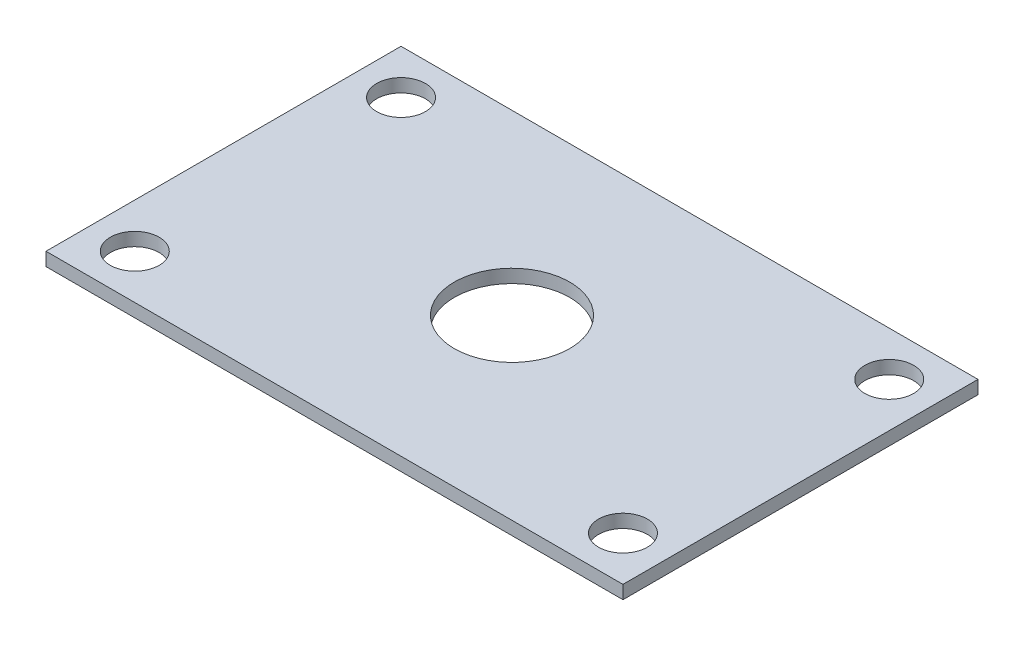
ISO-10303-21;
HEADER;
FILE_DESCRIPTION(('STEP AP214'),'2;1');
FILE_NAME('part.step','',(''),(''),'','','');
FILE_SCHEMA(('AUTOMOTIVE_DESIGN { 1 0 10303 214 1 1 1 1 }'));
ENDSEC;
DATA;
#1=APPLICATION_CONTEXT('core data for automotive mechanical design processes');
#2=APPLICATION_PROTOCOL_DEFINITION('international standard','automotive_design',2000,#1);
#3=PRODUCT_CONTEXT('',#1,'mechanical');
#4=PRODUCT('Part','Part','',(#3));
#5=PRODUCT_RELATED_PRODUCT_CATEGORY('part','',(#4));
#6=PRODUCT_DEFINITION_FORMATION('','',#4);
#7=PRODUCT_DEFINITION_CONTEXT('part definition',#1,'design');
#8=PRODUCT_DEFINITION('design','',#6,#7);
#9=PRODUCT_DEFINITION_SHAPE('','',#8);
#10=(LENGTH_UNIT() NAMED_UNIT(*) SI_UNIT(.MILLI.,.METRE.));
#11=(NAMED_UNIT(*) PLANE_ANGLE_UNIT() SI_UNIT($,.RADIAN.));
#12=(NAMED_UNIT(*) SI_UNIT($,.STERADIAN.) SOLID_ANGLE_UNIT());
#13=UNCERTAINTY_MEASURE_WITH_UNIT(LENGTH_MEASURE(1.E-05),#10,'distance_accuracy_value','');
#14=(GEOMETRIC_REPRESENTATION_CONTEXT(3) GLOBAL_UNCERTAINTY_ASSIGNED_CONTEXT((#13)) GLOBAL_UNIT_ASSIGNED_CONTEXT((#10,
#11,#12)) REPRESENTATION_CONTEXT('',''));
#15=CARTESIAN_POINT('',(0.,0.,0.));
#16=DIRECTION('',(0.,0.,1.));
#17=DIRECTION('',(1.,0.,0.));
#18=AXIS2_PLACEMENT_3D('',#15,#16,#17);
#19=CARTESIAN_POINT('',(65.,3.,-40.));
#20=DIRECTION('',(-1.,0.,0.));
#21=DIRECTION('',(0.,0.,1.));
#22=AXIS2_PLACEMENT_3D('',#19,#20,#21);
#23=PLANE('',#22);
#24=DIRECTION('',(0.,0.,-1.));
#25=VECTOR('',#24,1.);
#26=CARTESIAN_POINT('',(65.,0.,-40.));
#27=LINE('',#26,#25);
#28=CARTESIAN_POINT('',(65.,0.,40.));
#29=VERTEX_POINT('',#28);
#30=CARTESIAN_POINT('',(65.,0.,-40.));
#31=VERTEX_POINT('',#30);
#32=EDGE_CURVE('E98',#29,#31,#27,.T.);
#33=ORIENTED_EDGE('',*,*,#32,.T.);
#34=DIRECTION('',(0.,-1.,0.));
#35=VECTOR('',#34,1.);
#36=CARTESIAN_POINT('',(65.,3.,-40.));
#37=LINE('',#36,#35);
#38=CARTESIAN_POINT('',(65.,3.,-40.));
#39=VERTEX_POINT('',#38);
#40=EDGE_CURVE('E11',#39,#31,#37,.T.);
#41=ORIENTED_EDGE('',*,*,#40,.F.);
#42=DIRECTION('',(0.,0.,-1.));
#43=VECTOR('',#42,1.);
#44=CARTESIAN_POINT('',(65.,3.,-40.));
#45=LINE('',#44,#43);
#46=CARTESIAN_POINT('',(65.,3.,40.));
#47=VERTEX_POINT('',#46);
#48=EDGE_CURVE('E86',#47,#39,#45,.T.);
#49=ORIENTED_EDGE('',*,*,#48,.F.);
#50=DIRECTION('',(0.,-1.,0.));
#51=VECTOR('',#50,1.);
#52=CARTESIAN_POINT('',(65.,3.,40.));
#53=LINE('',#52,#51);
#54=EDGE_CURVE('E94',#47,#29,#53,.T.);
#55=ORIENTED_EDGE('',*,*,#54,.T.);
#56=EDGE_LOOP('',(#33,#41,#49,#55));
#57=FACE_BOUND('',#56,.T.);
#58=ADVANCED_FACE('F35',(#57),#23,.F.);
#59=CARTESIAN_POINT('',(-65.,3.,-40.));
#60=DIRECTION('',(0.,0.,1.));
#61=DIRECTION('',(1.,0.,0.));
#62=AXIS2_PLACEMENT_3D('',#59,#60,#61);
#63=PLANE('',#62);
#64=DIRECTION('',(-1.,0.,0.));
#65=VECTOR('',#64,1.);
#66=CARTESIAN_POINT('',(-65.,0.,-40.));
#67=LINE('',#66,#65);
#68=CARTESIAN_POINT('',(-65.,0.,-40.));
#69=VERTEX_POINT('',#68);
#70=EDGE_CURVE('E90',#31,#69,#67,.T.);
#71=ORIENTED_EDGE('',*,*,#70,.T.);
#72=DIRECTION('',(0.,-1.,0.));
#73=VECTOR('',#72,1.);
#74=CARTESIAN_POINT('',(-65.,3.,-40.));
#75=LINE('',#74,#73);
#76=CARTESIAN_POINT('',(-65.,3.,-40.));
#77=VERTEX_POINT('',#76);
#78=EDGE_CURVE('E43',#77,#69,#75,.T.);
#79=ORIENTED_EDGE('',*,*,#78,.F.);
#80=DIRECTION('',(-1.,0.,0.));
#81=VECTOR('',#80,1.);
#82=CARTESIAN_POINT('',(-65.,3.,-40.));
#83=LINE('',#82,#81);
#84=EDGE_CURVE('E81',#39,#77,#83,.T.);
#85=ORIENTED_EDGE('',*,*,#84,.F.);
#86=ORIENTED_EDGE('',*,*,#40,.T.);
#87=EDGE_LOOP('',(#71,#79,#85,#86));
#88=FACE_BOUND('',#87,.T.);
#89=ADVANCED_FACE('F89',(#88),#63,.F.);
#90=CARTESIAN_POINT('',(-65.,3.,-40.));
#91=DIRECTION('',(1.,0.,0.));
#92=DIRECTION('',(0.,0.,-1.));
#93=AXIS2_PLACEMENT_3D('',#90,#91,#92);
#94=PLANE('',#93);
#95=DIRECTION('',(0.,0.,1.));
#96=VECTOR('',#95,1.);
#97=CARTESIAN_POINT('',(-65.,0.,-40.));
#98=LINE('',#97,#96);
#99=CARTESIAN_POINT('',(-65.,0.,40.));
#100=VERTEX_POINT('',#99);
#101=EDGE_CURVE('E68',#69,#100,#98,.T.);
#102=ORIENTED_EDGE('',*,*,#101,.T.);
#103=DIRECTION('',(0.,-1.,0.));
#104=VECTOR('',#103,1.);
#105=CARTESIAN_POINT('',(-65.,3.,40.));
#106=LINE('',#105,#104);
#107=CARTESIAN_POINT('',(-65.,3.,40.));
#108=VERTEX_POINT('',#107);
#109=EDGE_CURVE('E91',#108,#100,#106,.T.);
#110=ORIENTED_EDGE('',*,*,#109,.F.);
#111=DIRECTION('',(0.,0.,1.));
#112=VECTOR('',#111,1.);
#113=CARTESIAN_POINT('',(-65.,3.,-40.));
#114=LINE('',#113,#112);
#115=EDGE_CURVE('E84',#77,#108,#114,.T.);
#116=ORIENTED_EDGE('',*,*,#115,.F.);
#117=ORIENTED_EDGE('',*,*,#78,.T.);
#118=EDGE_LOOP('',(#102,#110,#116,#117));
#119=FACE_BOUND('',#118,.T.);
#120=ADVANCED_FACE('F92',(#119),#94,.F.);
#121=CARTESIAN_POINT('',(-65.,3.,40.));
#122=DIRECTION('',(0.,0.,-1.));
#123=DIRECTION('',(-1.,0.,0.));
#124=AXIS2_PLACEMENT_3D('',#121,#122,#123);
#125=PLANE('',#124);
#126=DIRECTION('',(1.,0.,0.));
#127=VECTOR('',#126,1.);
#128=CARTESIAN_POINT('',(-65.,0.,40.));
#129=LINE('',#128,#127);
#130=EDGE_CURVE('E74',#100,#29,#129,.T.);
#131=ORIENTED_EDGE('',*,*,#130,.T.);
#132=ORIENTED_EDGE('',*,*,#54,.F.);
#133=DIRECTION('',(1.,0.,0.));
#134=VECTOR('',#133,1.);
#135=CARTESIAN_POINT('',(-65.,3.,40.));
#136=LINE('',#135,#134);
#137=EDGE_CURVE('E51',#108,#47,#136,.T.);
#138=ORIENTED_EDGE('',*,*,#137,.F.);
#139=ORIENTED_EDGE('',*,*,#109,.T.);
#140=EDGE_LOOP('',(#131,#132,#138,#139));
#141=FACE_BOUND('',#140,.T.);
#142=ADVANCED_FACE('F106',(#141),#125,.F.);
#143=CARTESIAN_POINT('',(0.,3.,0.));
#144=DIRECTION('',(0.,1.,0.));
#145=DIRECTION('',(0.,0.,1.));
#146=AXIS2_PLACEMENT_3D('',#143,#144,#145);
#147=PLANE('',#146);
#148=CARTESIAN_POINT('',(55.,3.,30.));
#149=DIRECTION('',(0.,1.,0.));
#150=DIRECTION('',(0.,0.,1.));
#151=AXIS2_PLACEMENT_3D('',#148,#149,#150);
#152=CIRCLE('',#151,5.5);
#153=CARTESIAN_POINT('',(55.,3.,35.5));
#154=VERTEX_POINT('',#153);
#155=EDGE_CURVE('E136',#154,#154,#152,.T.);
#156=ORIENTED_EDGE('',*,*,#155,.F.);
#157=EDGE_LOOP('',(#156));
#158=FACE_BOUND('',#157,.T.);
#159=CARTESIAN_POINT('',(55.,3.,-30.));
#160=DIRECTION('',(0.,1.,0.));
#161=DIRECTION('',(0.,0.,1.));
#162=AXIS2_PLACEMENT_3D('',#159,#160,#161);
#163=CIRCLE('',#162,5.5);
#164=CARTESIAN_POINT('',(55.,3.,-24.5));
#165=VERTEX_POINT('',#164);
#166=EDGE_CURVE('E130',#165,#165,#163,.T.);
#167=ORIENTED_EDGE('',*,*,#166,.F.);
#168=EDGE_LOOP('',(#167));
#169=FACE_BOUND('',#168,.T.);
#170=CARTESIAN_POINT('',(-55.,3.,30.));
#171=DIRECTION('',(0.,1.,0.));
#172=DIRECTION('',(0.,0.,1.));
#173=AXIS2_PLACEMENT_3D('',#170,#171,#172);
#174=CIRCLE('',#173,5.5);
#175=CARTESIAN_POINT('',(-55.,3.,35.5));
#176=VERTEX_POINT('',#175);
#177=EDGE_CURVE('E124',#176,#176,#174,.T.);
#178=ORIENTED_EDGE('',*,*,#177,.F.);
#179=EDGE_LOOP('',(#178));
#180=FACE_BOUND('',#179,.T.);
#181=CARTESIAN_POINT('',(-55.,3.,-30.));
#182=DIRECTION('',(0.,1.,0.));
#183=DIRECTION('',(0.,0.,1.));
#184=AXIS2_PLACEMENT_3D('',#181,#182,#183);
#185=CIRCLE('',#184,5.5);
#186=CARTESIAN_POINT('',(-55.,3.,-24.5));
#187=VERTEX_POINT('',#186);
#188=EDGE_CURVE('E118',#187,#187,#185,.T.);
#189=ORIENTED_EDGE('',*,*,#188,.F.);
#190=EDGE_LOOP('',(#189));
#191=FACE_BOUND('',#190,.T.);
#192=CARTESIAN_POINT('',(0.,3.,0.));
#193=DIRECTION('',(0.,1.,0.));
#194=DIRECTION('',(0.,0.,1.));
#195=AXIS2_PLACEMENT_3D('',#192,#193,#194);
#196=CIRCLE('',#195,13.);
#197=CARTESIAN_POINT('',(0.,3.,13.));
#198=VERTEX_POINT('',#197);
#199=EDGE_CURVE('E112',#198,#198,#196,.T.);
#200=ORIENTED_EDGE('',*,*,#199,.F.);
#201=EDGE_LOOP('',(#200));
#202=FACE_BOUND('',#201,.T.);
#203=ORIENTED_EDGE('',*,*,#48,.T.);
#204=ORIENTED_EDGE('',*,*,#84,.T.);
#205=ORIENTED_EDGE('',*,*,#115,.T.);
#206=ORIENTED_EDGE('',*,*,#137,.T.);
#207=EDGE_LOOP('',(#203,#204,#205,#206));
#208=FACE_BOUND('',#207,.T.);
#209=ADVANCED_FACE('F82',(#158,#169,#180,#191,#202,#208),#147,.T.);
#210=CARTESIAN_POINT('',(0.,0.,0.));
#211=DIRECTION('',(0.,1.,0.));
#212=DIRECTION('',(0.,0.,1.));
#213=AXIS2_PLACEMENT_3D('',#210,#211,#212);
#214=PLANE('',#213);
#215=CARTESIAN_POINT('',(55.,0.,30.));
#216=DIRECTION('',(0.,1.,0.));
#217=DIRECTION('',(0.,0.,1.));
#218=AXIS2_PLACEMENT_3D('',#215,#216,#217);
#219=CIRCLE('',#218,5.5);
#220=CARTESIAN_POINT('',(55.,0.,35.5));
#221=VERTEX_POINT('',#220);
#222=EDGE_CURVE('E133',#221,#221,#219,.T.);
#223=ORIENTED_EDGE('',*,*,#222,.T.);
#224=EDGE_LOOP('',(#223));
#225=FACE_BOUND('',#224,.T.);
#226=CARTESIAN_POINT('',(55.,0.,-30.));
#227=DIRECTION('',(0.,1.,0.));
#228=DIRECTION('',(0.,0.,1.));
#229=AXIS2_PLACEMENT_3D('',#226,#227,#228);
#230=CIRCLE('',#229,5.5);
#231=CARTESIAN_POINT('',(55.,0.,-24.5));
#232=VERTEX_POINT('',#231);
#233=EDGE_CURVE('E127',#232,#232,#230,.T.);
#234=ORIENTED_EDGE('',*,*,#233,.T.);
#235=EDGE_LOOP('',(#234));
#236=FACE_BOUND('',#235,.T.);
#237=CARTESIAN_POINT('',(-55.,0.,30.));
#238=DIRECTION('',(0.,1.,0.));
#239=DIRECTION('',(0.,0.,1.));
#240=AXIS2_PLACEMENT_3D('',#237,#238,#239);
#241=CIRCLE('',#240,5.5);
#242=CARTESIAN_POINT('',(-55.,0.,35.5));
#243=VERTEX_POINT('',#242);
#244=EDGE_CURVE('E121',#243,#243,#241,.T.);
#245=ORIENTED_EDGE('',*,*,#244,.T.);
#246=EDGE_LOOP('',(#245));
#247=FACE_BOUND('',#246,.T.);
#248=CARTESIAN_POINT('',(-55.,0.,-30.));
#249=DIRECTION('',(0.,1.,0.));
#250=DIRECTION('',(0.,0.,1.));
#251=AXIS2_PLACEMENT_3D('',#248,#249,#250);
#252=CIRCLE('',#251,5.5);
#253=CARTESIAN_POINT('',(-55.,0.,-24.5));
#254=VERTEX_POINT('',#253);
#255=EDGE_CURVE('E115',#254,#254,#252,.T.);
#256=ORIENTED_EDGE('',*,*,#255,.T.);
#257=EDGE_LOOP('',(#256));
#258=FACE_BOUND('',#257,.T.);
#259=CARTESIAN_POINT('',(0.,0.,0.));
#260=DIRECTION('',(0.,1.,0.));
#261=DIRECTION('',(0.,0.,1.));
#262=AXIS2_PLACEMENT_3D('',#259,#260,#261);
#263=CIRCLE('',#262,13.);
#264=CARTESIAN_POINT('',(0.,0.,13.));
#265=VERTEX_POINT('',#264);
#266=EDGE_CURVE('E101',#265,#265,#263,.T.);
#267=ORIENTED_EDGE('',*,*,#266,.T.);
#268=EDGE_LOOP('',(#267));
#269=FACE_BOUND('',#268,.T.);
#270=ORIENTED_EDGE('',*,*,#32,.F.);
#271=ORIENTED_EDGE('',*,*,#130,.F.);
#272=ORIENTED_EDGE('',*,*,#101,.F.);
#273=ORIENTED_EDGE('',*,*,#70,.F.);
#274=EDGE_LOOP('',(#270,#271,#272,#273));
#275=FACE_BOUND('',#274,.T.);
#276=ADVANCED_FACE('F109',(#225,#236,#247,#258,#269,#275),#214,.F.);
#277=CARTESIAN_POINT('',(0.,0.,0.));
#278=DIRECTION('',(0.,1.,0.));
#279=DIRECTION('',(0.,0.,1.));
#280=AXIS2_PLACEMENT_3D('',#277,#278,#279);
#281=CYLINDRICAL_SURFACE('',#280,13.);
#282=ORIENTED_EDGE('',*,*,#266,.F.);
#283=EDGE_LOOP('',(#282));
#284=FACE_BOUND('',#283,.T.);
#285=ORIENTED_EDGE('',*,*,#199,.T.);
#286=EDGE_LOOP('',(#285));
#287=FACE_BOUND('',#286,.T.);
#288=ADVANCED_FACE('F162',(#284,#287),#281,.F.);
#289=CARTESIAN_POINT('',(-55.,0.,-30.));
#290=DIRECTION('',(0.,1.,0.));
#291=DIRECTION('',(0.,0.,1.));
#292=AXIS2_PLACEMENT_3D('',#289,#290,#291);
#293=CYLINDRICAL_SURFACE('',#292,5.5);
#294=ORIENTED_EDGE('',*,*,#255,.F.);
#295=EDGE_LOOP('',(#294));
#296=FACE_BOUND('',#295,.T.);
#297=ORIENTED_EDGE('',*,*,#188,.T.);
#298=EDGE_LOOP('',(#297));
#299=FACE_BOUND('',#298,.T.);
#300=ADVANCED_FACE('F164',(#296,#299),#293,.F.);
#301=CARTESIAN_POINT('',(-55.,0.,30.));
#302=DIRECTION('',(0.,1.,0.));
#303=DIRECTION('',(0.,0.,1.));
#304=AXIS2_PLACEMENT_3D('',#301,#302,#303);
#305=CYLINDRICAL_SURFACE('',#304,5.5);
#306=ORIENTED_EDGE('',*,*,#244,.F.);
#307=EDGE_LOOP('',(#306));
#308=FACE_BOUND('',#307,.T.);
#309=ORIENTED_EDGE('',*,*,#177,.T.);
#310=EDGE_LOOP('',(#309));
#311=FACE_BOUND('',#310,.T.);
#312=ADVANCED_FACE('F171',(#308,#311),#305,.F.);
#313=CARTESIAN_POINT('',(55.,0.,-30.));
#314=DIRECTION('',(0.,1.,0.));
#315=DIRECTION('',(0.,0.,1.));
#316=AXIS2_PLACEMENT_3D('',#313,#314,#315);
#317=CYLINDRICAL_SURFACE('',#316,5.5);
#318=ORIENTED_EDGE('',*,*,#233,.F.);
#319=EDGE_LOOP('',(#318));
#320=FACE_BOUND('',#319,.T.);
#321=ORIENTED_EDGE('',*,*,#166,.T.);
#322=EDGE_LOOP('',(#321));
#323=FACE_BOUND('',#322,.T.);
#324=ADVANCED_FACE('F147',(#320,#323),#317,.F.);
#325=CARTESIAN_POINT('',(55.,0.,30.));
#326=DIRECTION('',(0.,1.,0.));
#327=DIRECTION('',(0.,0.,1.));
#328=AXIS2_PLACEMENT_3D('',#325,#326,#327);
#329=CYLINDRICAL_SURFACE('',#328,5.5);
#330=ORIENTED_EDGE('',*,*,#222,.F.);
#331=EDGE_LOOP('',(#330));
#332=FACE_BOUND('',#331,.T.);
#333=ORIENTED_EDGE('',*,*,#155,.T.);
#334=EDGE_LOOP('',(#333));
#335=FACE_BOUND('',#334,.T.);
#336=ADVANCED_FACE('F144',(#332,#335),#329,.F.);
#337=CLOSED_SHELL('',(#58,#89,#120,#142,#209,#276,#288,#300,#312,#324,#336));
#338=MANIFOLD_SOLID_BREP('B2',#337);
#339=ADVANCED_BREP_SHAPE_REPRESENTATION('',(#18,#338),#14);
#340=SHAPE_DEFINITION_REPRESENTATION(#9,#339);
ENDSEC;
END-ISO-10303-21;
